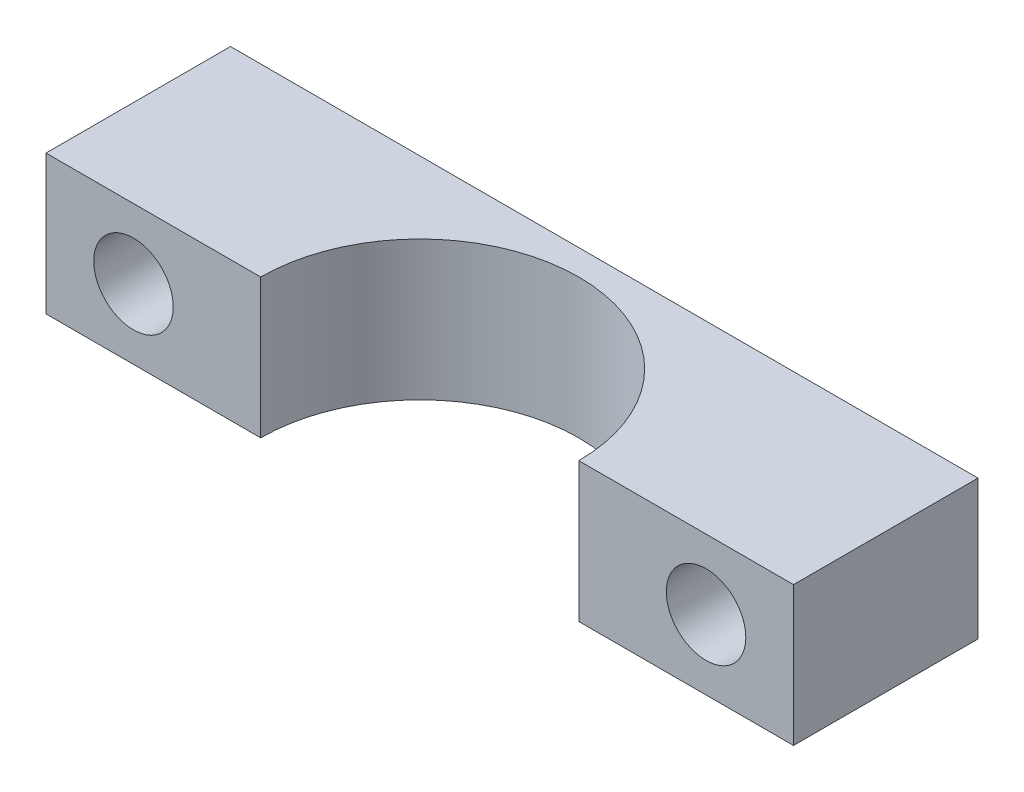
ISO-10303-21;
HEADER;
FILE_DESCRIPTION(('STEP AP214'),'2;1');
FILE_NAME('part.step','',(''),(''),'','','');
FILE_SCHEMA(('AUTOMOTIVE_DESIGN { 1 0 10303 214 1 1 1 1 }'));
ENDSEC;
DATA;
#1=APPLICATION_CONTEXT('core data for automotive mechanical design processes');
#2=APPLICATION_PROTOCOL_DEFINITION('international standard','automotive_design',2000,#1);
#3=PRODUCT_CONTEXT('',#1,'mechanical');
#4=PRODUCT('Part','Part','',(#3));
#5=PRODUCT_RELATED_PRODUCT_CATEGORY('part','',(#4));
#6=PRODUCT_DEFINITION_FORMATION('','',#4);
#7=PRODUCT_DEFINITION_CONTEXT('part definition',#1,'design');
#8=PRODUCT_DEFINITION('design','',#6,#7);
#9=PRODUCT_DEFINITION_SHAPE('','',#8);
#10=(LENGTH_UNIT() NAMED_UNIT(*) SI_UNIT(.MILLI.,.METRE.));
#11=(NAMED_UNIT(*) PLANE_ANGLE_UNIT() SI_UNIT($,.RADIAN.));
#12=(NAMED_UNIT(*) SI_UNIT($,.STERADIAN.) SOLID_ANGLE_UNIT());
#13=UNCERTAINTY_MEASURE_WITH_UNIT(LENGTH_MEASURE(1.E-05),#10,'distance_accuracy_value','');
#14=(GEOMETRIC_REPRESENTATION_CONTEXT(3) GLOBAL_UNCERTAINTY_ASSIGNED_CONTEXT((#13)) GLOBAL_UNIT_ASSIGNED_CONTEXT((#10,
#11,#12)) REPRESENTATION_CONTEXT('',''));
#15=CARTESIAN_POINT('',(0.,0.,0.));
#16=DIRECTION('',(0.,0.,1.));
#17=DIRECTION('',(1.,0.,0.));
#18=AXIS2_PLACEMENT_3D('',#15,#16,#17);
#19=CARTESIAN_POINT('',(0.,5.5626,0.));
#20=DIRECTION('',(0.,-1.,0.));
#21=DIRECTION('',(0.,0.,-1.));
#22=AXIS2_PLACEMENT_3D('',#19,#20,#21);
#23=CYLINDRICAL_SURFACE('',#22,12.7);
#24=CARTESIAN_POINT('',(0.,-5.5626,0.));
#25=DIRECTION('',(0.,-1.,0.));
#26=DIRECTION('',(0.,0.,-1.));
#27=AXIS2_PLACEMENT_3D('',#24,#25,#26);
#28=CIRCLE('',#27,12.7);
#29=CARTESIAN_POINT('',(-12.7,-5.5626,0.));
#30=VERTEX_POINT('',#29);
#31=CARTESIAN_POINT('',(12.7,-5.5626,0.));
#32=VERTEX_POINT('',#31);
#33=EDGE_CURVE('E125',#30,#32,#28,.T.);
#34=ORIENTED_EDGE('',*,*,#33,.T.);
#35=DIRECTION('',(0.,-1.,0.));
#36=VECTOR('',#35,1.);
#37=CARTESIAN_POINT('',(12.7,5.5626,0.));
#38=LINE('',#37,#36);
#39=CARTESIAN_POINT('',(12.7,5.5626,0.));
#40=VERTEX_POINT('',#39);
#41=EDGE_CURVE('E11',#40,#32,#38,.T.);
#42=ORIENTED_EDGE('',*,*,#41,.F.);
#43=CARTESIAN_POINT('',(0.,5.5626,0.));
#44=DIRECTION('',(0.,-1.,0.));
#45=DIRECTION('',(0.,0.,-1.));
#46=AXIS2_PLACEMENT_3D('',#43,#44,#45);
#47=CIRCLE('',#46,12.7);
#48=CARTESIAN_POINT('',(-12.7,5.5626,0.));
#49=VERTEX_POINT('',#48);
#50=EDGE_CURVE('E136',#49,#40,#47,.T.);
#51=ORIENTED_EDGE('',*,*,#50,.F.);
#52=DIRECTION('',(0.,-1.,0.));
#53=VECTOR('',#52,1.);
#54=CARTESIAN_POINT('',(-12.7,5.5626,0.));
#55=LINE('',#54,#53);
#56=EDGE_CURVE('E121',#49,#30,#55,.T.);
#57=ORIENTED_EDGE('',*,*,#56,.T.);
#58=EDGE_LOOP('',(#34,#42,#51,#57));
#59=FACE_BOUND('',#58,.T.);
#60=ADVANCED_FACE('F41',(#59),#23,.F.);
#61=CARTESIAN_POINT('',(29.845,5.5626,0.));
#62=DIRECTION('',(0.,0.,-1.));
#63=DIRECTION('',(-1.,0.,0.));
#64=AXIS2_PLACEMENT_3D('',#61,#62,#63);
#65=PLANE('',#64);
#66=CARTESIAN_POINT('',(22.86,0.,0.));
#67=DIRECTION('',(0.,0.,1.));
#68=DIRECTION('',(1.,0.,0.));
#69=AXIS2_PLACEMENT_3D('',#66,#67,#68);
#70=CIRCLE('',#69,3.175);
#71=CARTESIAN_POINT('',(26.035,0.,0.));
#72=VERTEX_POINT('',#71);
#73=EDGE_CURVE('E187',#72,#72,#70,.T.);
#74=ORIENTED_EDGE('',*,*,#73,.F.);
#75=EDGE_LOOP('',(#74));
#76=FACE_BOUND('',#75,.T.);
#77=DIRECTION('',(1.,0.,0.));
#78=VECTOR('',#77,1.);
#79=CARTESIAN_POINT('',(29.845,-5.5626,0.));
#80=LINE('',#79,#78);
#81=CARTESIAN_POINT('',(29.845,-5.5626,0.));
#82=VERTEX_POINT('',#81);
#83=EDGE_CURVE('E128',#32,#82,#80,.T.);
#84=ORIENTED_EDGE('',*,*,#83,.T.);
#85=DIRECTION('',(0.,-1.,0.));
#86=VECTOR('',#85,1.);
#87=CARTESIAN_POINT('',(29.845,5.5626,0.));
#88=LINE('',#87,#86);
#89=CARTESIAN_POINT('',(29.845,5.5626,0.));
#90=VERTEX_POINT('',#89);
#91=EDGE_CURVE('E49',#90,#82,#88,.T.);
#92=ORIENTED_EDGE('',*,*,#91,.F.);
#93=DIRECTION('',(1.,0.,0.));
#94=VECTOR('',#93,1.);
#95=CARTESIAN_POINT('',(29.845,5.5626,0.));
#96=LINE('',#95,#94);
#97=EDGE_CURVE('E94',#40,#90,#96,.T.);
#98=ORIENTED_EDGE('',*,*,#97,.F.);
#99=ORIENTED_EDGE('',*,*,#41,.T.);
#100=EDGE_LOOP('',(#84,#92,#98,#99));
#101=FACE_BOUND('',#100,.T.);
#102=ADVANCED_FACE('F164',(#76,#101),#65,.F.);
#103=CARTESIAN_POINT('',(29.845,5.5626,-14.732));
#104=DIRECTION('',(-1.,0.,0.));
#105=DIRECTION('',(0.,0.,1.));
#106=AXIS2_PLACEMENT_3D('',#103,#104,#105);
#107=PLANE('',#106);
#108=DIRECTION('',(0.,0.,-1.));
#109=VECTOR('',#108,1.);
#110=CARTESIAN_POINT('',(29.845,-5.5626,-14.732));
#111=LINE('',#110,#109);
#112=CARTESIAN_POINT('',(29.845,-5.5626,-14.732));
#113=VERTEX_POINT('',#112);
#114=EDGE_CURVE('E131',#82,#113,#111,.T.);
#115=ORIENTED_EDGE('',*,*,#114,.T.);
#116=DIRECTION('',(0.,-1.,0.));
#117=VECTOR('',#116,1.);
#118=CARTESIAN_POINT('',(29.845,5.5626,-14.732));
#119=LINE('',#118,#117);
#120=CARTESIAN_POINT('',(29.845,5.5626,-14.732));
#121=VERTEX_POINT('',#120);
#122=EDGE_CURVE('E116',#121,#113,#119,.T.);
#123=ORIENTED_EDGE('',*,*,#122,.F.);
#124=DIRECTION('',(0.,0.,-1.));
#125=VECTOR('',#124,1.);
#126=CARTESIAN_POINT('',(29.845,5.5626,-14.732));
#127=LINE('',#126,#125);
#128=EDGE_CURVE('E107',#90,#121,#127,.T.);
#129=ORIENTED_EDGE('',*,*,#128,.F.);
#130=ORIENTED_EDGE('',*,*,#91,.T.);
#131=EDGE_LOOP('',(#115,#123,#129,#130));
#132=FACE_BOUND('',#131,.T.);
#133=ADVANCED_FACE('F142',(#132),#107,.F.);
#134=CARTESIAN_POINT('',(-29.845,5.5626,-14.732));
#135=DIRECTION('',(0.,0.,1.));
#136=DIRECTION('',(1.,0.,0.));
#137=AXIS2_PLACEMENT_3D('',#134,#135,#136);
#138=PLANE('',#137);
#139=CARTESIAN_POINT('',(-22.86,0.,-14.732));
#140=DIRECTION('',(0.,0.,1.));
#141=DIRECTION('',(1.,0.,0.));
#142=AXIS2_PLACEMENT_3D('',#139,#140,#141);
#143=CIRCLE('',#142,3.175);
#144=CARTESIAN_POINT('',(-19.685,0.,-14.732));
#145=VERTEX_POINT('',#144);
#146=EDGE_CURVE('E129',#145,#145,#143,.T.);
#147=ORIENTED_EDGE('',*,*,#146,.T.);
#148=EDGE_LOOP('',(#147));
#149=FACE_BOUND('',#148,.T.);
#150=CARTESIAN_POINT('',(22.86,0.,-14.732));
#151=DIRECTION('',(0.,0.,1.));
#152=DIRECTION('',(1.,0.,0.));
#153=AXIS2_PLACEMENT_3D('',#150,#151,#152);
#154=CIRCLE('',#153,3.175);
#155=CARTESIAN_POINT('',(26.035,0.,-14.732));
#156=VERTEX_POINT('',#155);
#157=EDGE_CURVE('E184',#156,#156,#154,.T.);
#158=ORIENTED_EDGE('',*,*,#157,.T.);
#159=EDGE_LOOP('',(#158));
#160=FACE_BOUND('',#159,.T.);
#161=DIRECTION('',(-1.,0.,0.));
#162=VECTOR('',#161,1.);
#163=CARTESIAN_POINT('',(-29.845,-5.5626,-14.732));
#164=LINE('',#163,#162);
#165=CARTESIAN_POINT('',(-29.845,-5.5626,-14.732));
#166=VERTEX_POINT('',#165);
#167=EDGE_CURVE('E115',#113,#166,#164,.T.);
#168=ORIENTED_EDGE('',*,*,#167,.T.);
#169=DIRECTION('',(0.,-1.,0.));
#170=VECTOR('',#169,1.);
#171=CARTESIAN_POINT('',(-29.845,5.5626,-14.732));
#172=LINE('',#171,#170);
#173=CARTESIAN_POINT('',(-29.845,5.5626,-14.732));
#174=VERTEX_POINT('',#173);
#175=EDGE_CURVE('E112',#174,#166,#172,.T.);
#176=ORIENTED_EDGE('',*,*,#175,.F.);
#177=DIRECTION('',(-1.,0.,0.));
#178=VECTOR('',#177,1.);
#179=CARTESIAN_POINT('',(-29.845,5.5626,-14.732));
#180=LINE('',#179,#178);
#181=EDGE_CURVE('E101',#121,#174,#180,.T.);
#182=ORIENTED_EDGE('',*,*,#181,.F.);
#183=ORIENTED_EDGE('',*,*,#122,.T.);
#184=EDGE_LOOP('',(#168,#176,#182,#183));
#185=FACE_BOUND('',#184,.T.);
#186=ADVANCED_FACE('F113',(#149,#160,#185),#138,.F.);
#187=CARTESIAN_POINT('',(-29.845,5.5626,0.));
#188=DIRECTION('',(1.,0.,0.));
#189=DIRECTION('',(0.,0.,-1.));
#190=AXIS2_PLACEMENT_3D('',#187,#188,#189);
#191=PLANE('',#190);
#192=DIRECTION('',(0.,0.,1.));
#193=VECTOR('',#192,1.);
#194=CARTESIAN_POINT('',(-29.845,-5.5626,0.));
#195=LINE('',#194,#193);
#196=CARTESIAN_POINT('',(-29.845,-5.5626,0.));
#197=VERTEX_POINT('',#196);
#198=EDGE_CURVE('E80',#166,#197,#195,.T.);
#199=ORIENTED_EDGE('',*,*,#198,.T.);
#200=DIRECTION('',(0.,-1.,0.));
#201=VECTOR('',#200,1.);
#202=CARTESIAN_POINT('',(-29.845,5.5626,0.));
#203=LINE('',#202,#201);
#204=CARTESIAN_POINT('',(-29.845,5.5626,0.));
#205=VERTEX_POINT('',#204);
#206=EDGE_CURVE('E117',#205,#197,#203,.T.);
#207=ORIENTED_EDGE('',*,*,#206,.F.);
#208=DIRECTION('',(0.,0.,1.));
#209=VECTOR('',#208,1.);
#210=CARTESIAN_POINT('',(-29.845,5.5626,0.));
#211=LINE('',#210,#209);
#212=EDGE_CURVE('E105',#174,#205,#211,.T.);
#213=ORIENTED_EDGE('',*,*,#212,.F.);
#214=ORIENTED_EDGE('',*,*,#175,.T.);
#215=EDGE_LOOP('',(#199,#207,#213,#214));
#216=FACE_BOUND('',#215,.T.);
#217=ADVANCED_FACE('F119',(#216),#191,.F.);
#218=CARTESIAN_POINT('',(-12.7,5.5626,0.));
#219=DIRECTION('',(0.,0.,-1.));
#220=DIRECTION('',(-1.,0.,0.));
#221=AXIS2_PLACEMENT_3D('',#218,#219,#220);
#222=PLANE('',#221);
#223=CARTESIAN_POINT('',(-22.86,0.,0.));
#224=DIRECTION('',(0.,0.,1.));
#225=DIRECTION('',(1.,0.,0.));
#226=AXIS2_PLACEMENT_3D('',#223,#224,#225);
#227=CIRCLE('',#226,3.175);
#228=CARTESIAN_POINT('',(-19.685,0.,0.));
#229=VERTEX_POINT('',#228);
#230=EDGE_CURVE('E186',#229,#229,#227,.T.);
#231=ORIENTED_EDGE('',*,*,#230,.F.);
#232=EDGE_LOOP('',(#231));
#233=FACE_BOUND('',#232,.T.);
#234=DIRECTION('',(1.,0.,0.));
#235=VECTOR('',#234,1.);
#236=CARTESIAN_POINT('',(-12.7,-5.5626,0.));
#237=LINE('',#236,#235);
#238=EDGE_CURVE('E86',#197,#30,#237,.T.);
#239=ORIENTED_EDGE('',*,*,#238,.T.);
#240=ORIENTED_EDGE('',*,*,#56,.F.);
#241=DIRECTION('',(1.,0.,0.));
#242=VECTOR('',#241,1.);
#243=CARTESIAN_POINT('',(-12.7,5.5626,0.));
#244=LINE('',#243,#242);
#245=EDGE_CURVE('E57',#205,#49,#244,.T.);
#246=ORIENTED_EDGE('',*,*,#245,.F.);
#247=ORIENTED_EDGE('',*,*,#206,.T.);
#248=EDGE_LOOP('',(#239,#240,#246,#247));
#249=FACE_BOUND('',#248,.T.);
#250=ADVANCED_FACE('F149',(#233,#249),#222,.F.);
#251=CARTESIAN_POINT('',(0.,5.5626,0.));
#252=DIRECTION('',(0.,-1.,0.));
#253=DIRECTION('',(0.,0.,-1.));
#254=AXIS2_PLACEMENT_3D('',#251,#252,#253);
#255=PLANE('',#254);
#256=ORIENTED_EDGE('',*,*,#50,.T.);
#257=ORIENTED_EDGE('',*,*,#97,.T.);
#258=ORIENTED_EDGE('',*,*,#128,.T.);
#259=ORIENTED_EDGE('',*,*,#181,.T.);
#260=ORIENTED_EDGE('',*,*,#212,.T.);
#261=ORIENTED_EDGE('',*,*,#245,.T.);
#262=EDGE_LOOP('',(#256,#257,#258,#259,#260,#261));
#263=FACE_BOUND('',#262,.T.);
#264=ADVANCED_FACE('F103',(#263),#255,.F.);
#265=CARTESIAN_POINT('',(0.,-5.5626,0.));
#266=DIRECTION('',(0.,-1.,0.));
#267=DIRECTION('',(0.,0.,-1.));
#268=AXIS2_PLACEMENT_3D('',#265,#266,#267);
#269=PLANE('',#268);
#270=ORIENTED_EDGE('',*,*,#33,.F.);
#271=ORIENTED_EDGE('',*,*,#238,.F.);
#272=ORIENTED_EDGE('',*,*,#198,.F.);
#273=ORIENTED_EDGE('',*,*,#167,.F.);
#274=ORIENTED_EDGE('',*,*,#114,.F.);
#275=ORIENTED_EDGE('',*,*,#83,.F.);
#276=EDGE_LOOP('',(#270,#271,#272,#273,#274,#275));
#277=FACE_BOUND('',#276,.T.);
#278=ADVANCED_FACE('F145',(#277),#269,.T.);
#279=CARTESIAN_POINT('',(-22.86,0.,-14.732));
#280=DIRECTION('',(0.,0.,1.));
#281=DIRECTION('',(1.,0.,0.));
#282=AXIS2_PLACEMENT_3D('',#279,#280,#281);
#283=CYLINDRICAL_SURFACE('',#282,3.175);
#284=CARTESIAN_POINT('',(-19.685,0.,-14.732));
#285=CARTESIAN_POINT('',(-19.685,0.,-14.5785416666667));
#286=CARTESIAN_POINT('',(-19.685,0.,-14.4250833333333));
#287=CARTESIAN_POINT('',(-19.685,0.,-14.1181666666667));
#288=CARTESIAN_POINT('',(-19.685,0.,-13.9647083333333));
#289=CARTESIAN_POINT('',(-19.685,0.,-13.6577916666667));
#290=CARTESIAN_POINT('',(-19.685,0.,-13.5043333333333));
#291=CARTESIAN_POINT('',(-19.685,0.,-13.1974166666667));
#292=CARTESIAN_POINT('',(-19.685,0.,-13.0439583333333));
#293=CARTESIAN_POINT('',(-19.685,0.,-12.7370416666667));
#294=CARTESIAN_POINT('',(-19.685,0.,-12.5835833333333));
#295=CARTESIAN_POINT('',(-19.685,0.,-12.2766666666667));
#296=CARTESIAN_POINT('',(-19.685,0.,-12.1232083333333));
#297=CARTESIAN_POINT('',(-19.685,0.,-11.8162916666667));
#298=CARTESIAN_POINT('',(-19.685,0.,-11.6628333333333));
#299=CARTESIAN_POINT('',(-19.685,0.,-11.3559166666667));
#300=CARTESIAN_POINT('',(-19.685,0.,-11.2024583333333));
#301=CARTESIAN_POINT('',(-19.685,0.,-10.8955416666667));
#302=CARTESIAN_POINT('',(-19.685,0.,-10.7420833333333));
#303=CARTESIAN_POINT('',(-19.685,0.,-10.4351666666667));
#304=CARTESIAN_POINT('',(-19.685,0.,-10.2817083333333));
#305=CARTESIAN_POINT('',(-19.685,0.,-9.97479166666667));
#306=CARTESIAN_POINT('',(-19.685,0.,-9.82133333333334));
#307=CARTESIAN_POINT('',(-19.685,0.,-9.51441666666667));
#308=CARTESIAN_POINT('',(-19.685,0.,-9.36095833333333));
#309=CARTESIAN_POINT('',(-19.685,0.,-9.05404166666667));
#310=CARTESIAN_POINT('',(-19.685,0.,-8.90058333333334));
#311=CARTESIAN_POINT('',(-19.685,0.,-8.59366666666667));
#312=CARTESIAN_POINT('',(-19.685,0.,-8.44020833333333));
#313=CARTESIAN_POINT('',(-19.685,0.,-8.13329166666667));
#314=CARTESIAN_POINT('',(-19.685,0.,-7.97983333333333));
#315=CARTESIAN_POINT('',(-19.685,0.,-7.67291666666667));
#316=CARTESIAN_POINT('',(-19.685,0.,-7.51945833333333));
#317=CARTESIAN_POINT('',(-19.685,0.,-7.21254166666667));
#318=CARTESIAN_POINT('',(-19.685,0.,-7.05908333333333));
#319=CARTESIAN_POINT('',(-19.685,0.,-6.75216666666667));
#320=CARTESIAN_POINT('',(-19.685,0.,-6.59870833333333));
#321=CARTESIAN_POINT('',(-19.685,0.,-6.29179166666667));
#322=CARTESIAN_POINT('',(-19.685,0.,-6.13833333333334));
#323=CARTESIAN_POINT('',(-19.685,0.,-5.83141666666667));
#324=CARTESIAN_POINT('',(-19.685,0.,-5.67795833333334));
#325=CARTESIAN_POINT('',(-19.685,0.,-5.37104166666667));
#326=CARTESIAN_POINT('',(-19.685,0.,-5.21758333333333));
#327=CARTESIAN_POINT('',(-19.685,0.,-4.91066666666667));
#328=CARTESIAN_POINT('',(-19.685,0.,-4.75720833333333));
#329=CARTESIAN_POINT('',(-19.685,0.,-4.45029166666667));
#330=CARTESIAN_POINT('',(-19.685,0.,-4.29683333333333));
#331=CARTESIAN_POINT('',(-19.685,0.,-3.98991666666667));
#332=CARTESIAN_POINT('',(-19.685,0.,-3.83645833333333));
#333=CARTESIAN_POINT('',(-19.685,0.,-3.52954166666667));
#334=CARTESIAN_POINT('',(-19.685,0.,-3.37608333333333));
#335=CARTESIAN_POINT('',(-19.685,0.,-3.06916666666667));
#336=CARTESIAN_POINT('',(-19.685,0.,-2.91570833333333));
#337=CARTESIAN_POINT('',(-19.685,0.,-2.60879166666667));
#338=CARTESIAN_POINT('',(-19.685,0.,-2.45533333333333));
#339=CARTESIAN_POINT('',(-19.685,0.,-2.14841666666667));
#340=CARTESIAN_POINT('',(-19.685,0.,-1.99495833333333));
#341=CARTESIAN_POINT('',(-19.685,0.,-1.68804166666667));
#342=CARTESIAN_POINT('',(-19.685,0.,-1.53458333333333));
#343=CARTESIAN_POINT('',(-19.685,0.,-1.22766666666667));
#344=CARTESIAN_POINT('',(-19.685,0.,-1.07420833333333));
#345=CARTESIAN_POINT('',(-19.685,0.,-0.767291666666667));
#346=CARTESIAN_POINT('',(-19.685,0.,-0.613833333333334));
#347=CARTESIAN_POINT('',(-19.685,0.,-0.306916666666667));
#348=CARTESIAN_POINT('',(-19.685,0.,-0.153458333333334));
#349=CARTESIAN_POINT('',(-19.685,0.,0.));
#350=B_SPLINE_CURVE_WITH_KNOTS('',3,(#284,#285,#286,#287,#288,#289,#290,#291,#292,#293,#294,
#295,#296,#297,#298,#299,#300,#301,#302,#303,#304,#305,#306,#307,#308,#309,#310,#311,#312,#313,
#314,#315,#316,#317,#318,#319,#320,#321,#322,#323,#324,#325,#326,#327,#328,#329,#330,#331,#332,
#333,#334,#335,#336,#337,#338,#339,#340,#341,#342,#343,#344,#345,#346,#347,#348,#349),
.UNSPECIFIED.,.F.,.F.,(4,2,2,2,2,2,2,2,2,2,2,2,2,2,2,2,2,2,2,2,2,2,2,2,2,2,2,2,2,2,2,2,4),(0.,
0.460375000000001,0.920750000000001,1.381125,1.8415,2.301875,2.76225,3.222625,3.683,4.143375,
4.60375,5.064125,5.5245,5.984875,6.44525,6.905625,7.366,7.826375,8.28675,8.747125,9.2075,
9.667875,10.12825,10.588625,11.049,11.509375,11.96975,12.430125,12.8905,13.350875,13.81125,
14.271625,14.732),.UNSPECIFIED.);
#351=EDGE_CURVE('BSEAM199',#145,#229,#350,.T.);
#352=ORIENTED_EDGE('',*,*,#146,.F.);
#353=ORIENTED_EDGE('',*,*,#230,.T.);
#354=ORIENTED_EDGE('',*,*,#351,.T.);
#355=ORIENTED_EDGE('',*,*,#351,.F.);
#356=EDGE_LOOP('',(#352,#354,#353,#355));
#357=FACE_BOUND('',#356,.T.);
#358=ADVANCED_FACE('F199',(#357),#283,.F.);
#359=CARTESIAN_POINT('',(22.86,0.,-14.732));
#360=DIRECTION('',(0.,0.,1.));
#361=DIRECTION('',(1.,0.,0.));
#362=AXIS2_PLACEMENT_3D('',#359,#360,#361);
#363=CYLINDRICAL_SURFACE('',#362,3.175);
#364=CARTESIAN_POINT('',(26.035,0.,-14.732));
#365=CARTESIAN_POINT('',(26.035,0.,-14.5785416666667));
#366=CARTESIAN_POINT('',(26.035,0.,-14.4250833333333));
#367=CARTESIAN_POINT('',(26.035,0.,-14.1181666666667));
#368=CARTESIAN_POINT('',(26.035,0.,-13.9647083333333));
#369=CARTESIAN_POINT('',(26.035,0.,-13.6577916666667));
#370=CARTESIAN_POINT('',(26.035,0.,-13.5043333333333));
#371=CARTESIAN_POINT('',(26.035,0.,-13.1974166666667));
#372=CARTESIAN_POINT('',(26.035,0.,-13.0439583333333));
#373=CARTESIAN_POINT('',(26.035,0.,-12.7370416666667));
#374=CARTESIAN_POINT('',(26.035,0.,-12.5835833333333));
#375=CARTESIAN_POINT('',(26.035,0.,-12.2766666666667));
#376=CARTESIAN_POINT('',(26.035,0.,-12.1232083333333));
#377=CARTESIAN_POINT('',(26.035,0.,-11.8162916666667));
#378=CARTESIAN_POINT('',(26.035,0.,-11.6628333333333));
#379=CARTESIAN_POINT('',(26.035,0.,-11.3559166666667));
#380=CARTESIAN_POINT('',(26.035,0.,-11.2024583333333));
#381=CARTESIAN_POINT('',(26.035,0.,-10.8955416666667));
#382=CARTESIAN_POINT('',(26.035,0.,-10.7420833333333));
#383=CARTESIAN_POINT('',(26.035,0.,-10.4351666666667));
#384=CARTESIAN_POINT('',(26.035,0.,-10.2817083333333));
#385=CARTESIAN_POINT('',(26.035,0.,-9.97479166666667));
#386=CARTESIAN_POINT('',(26.035,0.,-9.82133333333334));
#387=CARTESIAN_POINT('',(26.035,0.,-9.51441666666667));
#388=CARTESIAN_POINT('',(26.035,0.,-9.36095833333333));
#389=CARTESIAN_POINT('',(26.035,0.,-9.05404166666667));
#390=CARTESIAN_POINT('',(26.035,0.,-8.90058333333334));
#391=CARTESIAN_POINT('',(26.035,0.,-8.59366666666667));
#392=CARTESIAN_POINT('',(26.035,0.,-8.44020833333333));
#393=CARTESIAN_POINT('',(26.035,0.,-8.13329166666667));
#394=CARTESIAN_POINT('',(26.035,0.,-7.97983333333333));
#395=CARTESIAN_POINT('',(26.035,0.,-7.67291666666667));
#396=CARTESIAN_POINT('',(26.035,0.,-7.51945833333333));
#397=CARTESIAN_POINT('',(26.035,0.,-7.21254166666667));
#398=CARTESIAN_POINT('',(26.035,0.,-7.05908333333333));
#399=CARTESIAN_POINT('',(26.035,0.,-6.75216666666667));
#400=CARTESIAN_POINT('',(26.035,0.,-6.59870833333333));
#401=CARTESIAN_POINT('',(26.035,0.,-6.29179166666667));
#402=CARTESIAN_POINT('',(26.035,0.,-6.13833333333334));
#403=CARTESIAN_POINT('',(26.035,0.,-5.83141666666667));
#404=CARTESIAN_POINT('',(26.035,0.,-5.67795833333334));
#405=CARTESIAN_POINT('',(26.035,0.,-5.37104166666667));
#406=CARTESIAN_POINT('',(26.035,0.,-5.21758333333333));
#407=CARTESIAN_POINT('',(26.035,0.,-4.91066666666667));
#408=CARTESIAN_POINT('',(26.035,0.,-4.75720833333333));
#409=CARTESIAN_POINT('',(26.035,0.,-4.45029166666667));
#410=CARTESIAN_POINT('',(26.035,0.,-4.29683333333333));
#411=CARTESIAN_POINT('',(26.035,0.,-3.98991666666667));
#412=CARTESIAN_POINT('',(26.035,0.,-3.83645833333333));
#413=CARTESIAN_POINT('',(26.035,0.,-3.52954166666667));
#414=CARTESIAN_POINT('',(26.035,0.,-3.37608333333333));
#415=CARTESIAN_POINT('',(26.035,0.,-3.06916666666667));
#416=CARTESIAN_POINT('',(26.035,0.,-2.91570833333333));
#417=CARTESIAN_POINT('',(26.035,0.,-2.60879166666667));
#418=CARTESIAN_POINT('',(26.035,0.,-2.45533333333333));
#419=CARTESIAN_POINT('',(26.035,0.,-2.14841666666667));
#420=CARTESIAN_POINT('',(26.035,0.,-1.99495833333333));
#421=CARTESIAN_POINT('',(26.035,0.,-1.68804166666667));
#422=CARTESIAN_POINT('',(26.035,0.,-1.53458333333333));
#423=CARTESIAN_POINT('',(26.035,0.,-1.22766666666667));
#424=CARTESIAN_POINT('',(26.035,0.,-1.07420833333333));
#425=CARTESIAN_POINT('',(26.035,0.,-0.767291666666667));
#426=CARTESIAN_POINT('',(26.035,0.,-0.613833333333334));
#427=CARTESIAN_POINT('',(26.035,0.,-0.306916666666667));
#428=CARTESIAN_POINT('',(26.035,0.,-0.153458333333334));
#429=CARTESIAN_POINT('',(26.035,0.,0.));
#430=B_SPLINE_CURVE_WITH_KNOTS('',3,(#364,#365,#366,#367,#368,#369,#370,#371,#372,#373,#374,
#375,#376,#377,#378,#379,#380,#381,#382,#383,#384,#385,#386,#387,#388,#389,#390,#391,#392,#393,
#394,#395,#396,#397,#398,#399,#400,#401,#402,#403,#404,#405,#406,#407,#408,#409,#410,#411,#412,
#413,#414,#415,#416,#417,#418,#419,#420,#421,#422,#423,#424,#425,#426,#427,#428,#429),
.UNSPECIFIED.,.F.,.F.,(4,2,2,2,2,2,2,2,2,2,2,2,2,2,2,2,2,2,2,2,2,2,2,2,2,2,2,2,2,2,2,2,4),(0.,
0.460375000000001,0.920750000000001,1.381125,1.8415,2.301875,2.76225,3.222625,3.683,4.143375,
4.60375,5.064125,5.5245,5.984875,6.44525,6.905625,7.366,7.826375,8.28675,8.747125,9.2075,
9.667875,10.12825,10.588625,11.049,11.509375,11.96975,12.430125,12.8905,13.350875,13.81125,
14.271625,14.732),.UNSPECIFIED.);
#431=EDGE_CURVE('BSEAM197',#156,#72,#430,.T.);
#432=ORIENTED_EDGE('',*,*,#157,.F.);
#433=ORIENTED_EDGE('',*,*,#73,.T.);
#434=ORIENTED_EDGE('',*,*,#431,.T.);
#435=ORIENTED_EDGE('',*,*,#431,.F.);
#436=EDGE_LOOP('',(#432,#434,#433,#435));
#437=FACE_BOUND('',#436,.T.);
#438=ADVANCED_FACE('F197',(#437),#363,.F.);
#439=CLOSED_SHELL('',(#60,#102,#133,#186,#217,#250,#264,#278,#358,#438));
#440=MANIFOLD_SOLID_BREP('B2',#439);
#441=ADVANCED_BREP_SHAPE_REPRESENTATION('',(#18,#440),#14);
#442=SHAPE_DEFINITION_REPRESENTATION(#9,#441);
ENDSEC;
END-ISO-10303-21;
